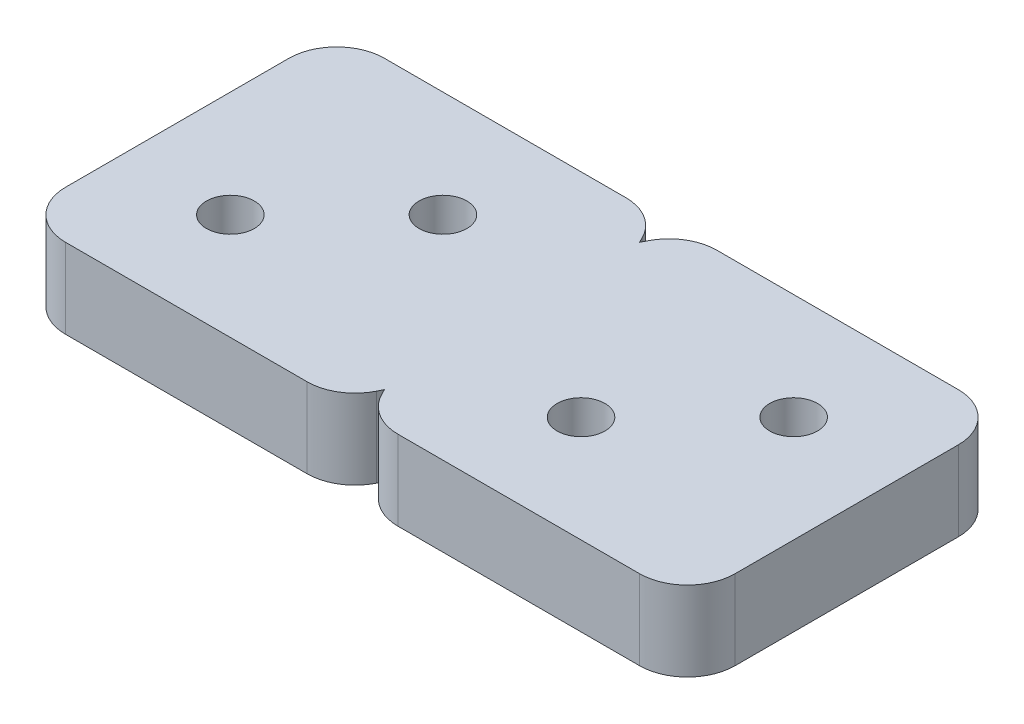
ISO-10303-21;
HEADER;
FILE_DESCRIPTION(('STEP AP214'),'2;1');
FILE_NAME('part.step','',(''),(''),'','','');
FILE_SCHEMA(('AUTOMOTIVE_DESIGN { 1 0 10303 214 1 1 1 1 }'));
ENDSEC;
DATA;
#1=APPLICATION_CONTEXT('core data for automotive mechanical design processes');
#2=APPLICATION_PROTOCOL_DEFINITION('international standard','automotive_design',2000,#1);
#3=PRODUCT_CONTEXT('',#1,'mechanical');
#4=PRODUCT('Part','Part','',(#3));
#5=PRODUCT_RELATED_PRODUCT_CATEGORY('part','',(#4));
#6=PRODUCT_DEFINITION_FORMATION('','',#4);
#7=PRODUCT_DEFINITION_CONTEXT('part definition',#1,'design');
#8=PRODUCT_DEFINITION('design','',#6,#7);
#9=PRODUCT_DEFINITION_SHAPE('','',#8);
#10=(LENGTH_UNIT() NAMED_UNIT(*) SI_UNIT(.MILLI.,.METRE.));
#11=(NAMED_UNIT(*) PLANE_ANGLE_UNIT() SI_UNIT($,.RADIAN.));
#12=(NAMED_UNIT(*) SI_UNIT($,.STERADIAN.) SOLID_ANGLE_UNIT());
#13=UNCERTAINTY_MEASURE_WITH_UNIT(LENGTH_MEASURE(1.E-05),#10,'distance_accuracy_value','');
#14=(GEOMETRIC_REPRESENTATION_CONTEXT(3) GLOBAL_UNCERTAINTY_ASSIGNED_CONTEXT((#13)) GLOBAL_UNIT_ASSIGNED_CONTEXT((#10,
#11,#12)) REPRESENTATION_CONTEXT('',''));
#15=CARTESIAN_POINT('',(0.,0.,0.));
#16=DIRECTION('',(0.,0.,1.));
#17=DIRECTION('',(1.,0.,0.));
#18=AXIS2_PLACEMENT_3D('',#15,#16,#17);
#19=CARTESIAN_POINT('',(0.,6.35,0.));
#20=DIRECTION('',(0.,1.,0.));
#21=DIRECTION('',(0.,0.,1.));
#22=AXIS2_PLACEMENT_3D('',#19,#20,#21);
#23=PLANE('',#22);
#24=CARTESIAN_POINT('',(-14.7588495726702,6.35,21.1656991837948));
#25=DIRECTION('',(0.,1.,0.));
#26=DIRECTION('',(0.,0.,1.));
#27=AXIS2_PLACEMENT_3D('',#24,#25,#26);
#28=CIRCLE('',#27,1.905);
#29=CARTESIAN_POINT('',(-14.7588495726702,6.35,23.0706991837948));
#30=VERTEX_POINT('',#29);
#31=EDGE_CURVE('E384',#30,#30,#28,.T.);
#32=ORIENTED_EDGE('',*,*,#31,.F.);
#33=EDGE_LOOP('',(#32));
#34=FACE_BOUND('',#33,.T.);
#35=CARTESIAN_POINT('',(-42.6988495726702,6.35,21.1656991837948));
#36=DIRECTION('',(0.,1.,0.));
#37=DIRECTION('',(0.,0.,1.));
#38=AXIS2_PLACEMENT_3D('',#35,#36,#37);
#39=CIRCLE('',#38,1.905);
#40=CARTESIAN_POINT('',(-42.6988495726702,6.35,23.0706991837948));
#41=VERTEX_POINT('',#40);
#42=EDGE_CURVE('E229',#41,#41,#39,.T.);
#43=ORIENTED_EDGE('',*,*,#42,.F.);
#44=EDGE_LOOP('',(#43));
#45=FACE_BOUND('',#44,.T.);
#46=DIRECTION('',(-1.,0.,0.));
#47=VECTOR('',#46,1.);
#48=CARTESIAN_POINT('',(-25.7642376761314,6.35,4.23108728725597));
#49=LINE('',#48,#47);
#50=CARTESIAN_POINT('',(-28.1189471732685,6.35,4.23108728725597));
#51=VERTEX_POINT('',#50);
#52=CARTESIAN_POINT('',(-47.3542376761314,6.35,4.23108728725597));
#53=VERTEX_POINT('',#52);
#54=EDGE_CURVE('E218',#51,#53,#49,.T.);
#55=ORIENTED_EDGE('',*,*,#54,.T.);
#56=CARTESIAN_POINT('',(-47.3542376761314,6.35,8.04108728725597));
#57=DIRECTION('',(0.,1.,0.));
#58=DIRECTION('',(0.,0.,1.));
#59=AXIS2_PLACEMENT_3D('',#56,#57,#58);
#60=CIRCLE('',#59,3.81);
#61=CARTESIAN_POINT('',(-51.1642376761314,6.35,8.04108728725597));
#62=VERTEX_POINT('',#61);
#63=EDGE_CURVE('E320',#53,#62,#60,.T.);
#64=ORIENTED_EDGE('',*,*,#63,.T.);
#65=DIRECTION('',(0.,0.,1.));
#66=VECTOR('',#65,1.);
#67=CARTESIAN_POINT('',(-51.1642376761314,6.35,4.23108728725597));
#68=LINE('',#67,#66);
#69=CARTESIAN_POINT('',(-51.1642376761314,6.35,25.821087287256));
#70=VERTEX_POINT('',#69);
#71=EDGE_CURVE('E221',#62,#70,#68,.T.);
#72=ORIENTED_EDGE('',*,*,#71,.T.);
#73=CARTESIAN_POINT('',(-47.3542376761314,6.35,25.821087287256));
#74=DIRECTION('',(0.,1.,0.));
#75=DIRECTION('',(0.,0.,1.));
#76=AXIS2_PLACEMENT_3D('',#73,#74,#75);
#77=CIRCLE('',#76,3.81);
#78=CARTESIAN_POINT('',(-47.3542376761314,6.35,29.631087287256));
#79=VERTEX_POINT('',#78);
#80=EDGE_CURVE('E301',#70,#79,#77,.T.);
#81=ORIENTED_EDGE('',*,*,#80,.T.);
#82=DIRECTION('',(1.,0.,0.));
#83=VECTOR('',#82,1.);
#84=CARTESIAN_POINT('',(-51.1642376761314,6.35,29.631087287256));
#85=LINE('',#84,#83);
#86=CARTESIAN_POINT('',(-28.1189471732685,6.35,29.631087287256));
#87=VERTEX_POINT('',#86);
#88=EDGE_CURVE('E180',#79,#87,#85,.T.);
#89=ORIENTED_EDGE('',*,*,#88,.T.);
#90=CARTESIAN_POINT('',(-28.1189471732685,6.35,25.821087287256));
#91=DIRECTION('',(0.,1.,0.));
#92=DIRECTION('',(0.,0.,1.));
#93=AXIS2_PLACEMENT_3D('',#90,#91,#92);
#94=CIRCLE('',#93,3.81);
#95=CARTESIAN_POINT('',(-24.7111795755588,6.35,27.5249710861108));
#96=VERTEX_POINT('',#95);
#97=EDGE_CURVE('E175',#87,#96,#94,.T.);
#98=ORIENTED_EDGE('',*,*,#97,.T.);
#99=DIRECTION('',(0.447213595499958,0.,-0.894427190999916));
#100=VECTOR('',#99,1.);
#101=CARTESIAN_POINT('',(-24.4942376761314,6.35,27.091087287256));
#102=LINE('',#101,#100);
#103=CARTESIAN_POINT('',(-24.4942376761314,6.35,27.091087287256));
#104=VERTEX_POINT('',#103);
#105=EDGE_CURVE('E166',#96,#104,#102,.T.);
#106=ORIENTED_EDGE('',*,*,#105,.T.);
#107=DIRECTION('',(0.447213595499958,0.,0.894427190999916));
#108=VECTOR('',#107,1.);
#109=CARTESIAN_POINT('',(-24.4942376761314,6.35,27.091087287256));
#110=LINE('',#109,#108);
#111=CARTESIAN_POINT('',(-24.277295776704,6.35,27.5249710861108));
#112=VERTEX_POINT('',#111);
#113=EDGE_CURVE('E171',#104,#112,#110,.T.);
#114=ORIENTED_EDGE('',*,*,#113,.T.);
#115=CARTESIAN_POINT('',(-20.8695281789943,6.35,25.821087287256));
#116=DIRECTION('',(0.,1.,0.));
#117=DIRECTION('',(0.,0.,1.));
#118=AXIS2_PLACEMENT_3D('',#115,#116,#117);
#119=CIRCLE('',#118,3.81);
#120=CARTESIAN_POINT('',(-20.8695281789943,6.35,29.631087287256));
#121=VERTEX_POINT('',#120);
#122=EDGE_CURVE('E306',#112,#121,#119,.T.);
#123=ORIENTED_EDGE('',*,*,#122,.T.);
#124=DIRECTION('',(1.,0.,0.));
#125=VECTOR('',#124,1.);
#126=CARTESIAN_POINT('',(-23.2242376761314,6.35,29.631087287256));
#127=LINE('',#126,#125);
#128=CARTESIAN_POINT('',(-1.63423767613143,6.35,29.631087287256));
#129=VERTEX_POINT('',#128);
#130=EDGE_CURVE('E198',#121,#129,#127,.T.);
#131=ORIENTED_EDGE('',*,*,#130,.T.);
#132=CARTESIAN_POINT('',(-1.63423767613143,6.35,25.821087287256));
#133=DIRECTION('',(0.,1.,0.));
#134=DIRECTION('',(0.,0.,1.));
#135=AXIS2_PLACEMENT_3D('',#132,#133,#134);
#136=CIRCLE('',#135,3.81);
#137=CARTESIAN_POINT('',(2.17576232386857,6.35,25.821087287256));
#138=VERTEX_POINT('',#137);
#139=EDGE_CURVE('E309',#129,#138,#136,.T.);
#140=ORIENTED_EDGE('',*,*,#139,.T.);
#141=DIRECTION('',(0.,0.,-1.));
#142=VECTOR('',#141,1.);
#143=CARTESIAN_POINT('',(2.17576232386857,6.35,29.631087287256));
#144=LINE('',#143,#142);
#145=CARTESIAN_POINT('',(2.17576232386857,6.35,8.04108728725596));
#146=VERTEX_POINT('',#145);
#147=EDGE_CURVE('E202',#138,#146,#144,.T.);
#148=ORIENTED_EDGE('',*,*,#147,.T.);
#149=CARTESIAN_POINT('',(-1.63423767613143,6.35,8.04108728725596));
#150=DIRECTION('',(0.,1.,0.));
#151=DIRECTION('',(0.,0.,1.));
#152=AXIS2_PLACEMENT_3D('',#149,#150,#151);
#153=CIRCLE('',#152,3.81);
#154=CARTESIAN_POINT('',(-1.63423767613143,6.35,4.23108728725597));
#155=VERTEX_POINT('',#154);
#156=EDGE_CURVE('E312',#146,#155,#153,.T.);
#157=ORIENTED_EDGE('',*,*,#156,.T.);
#158=DIRECTION('',(-1.,0.,0.));
#159=VECTOR('',#158,1.);
#160=CARTESIAN_POINT('',(2.17576232386857,6.35,4.23108728725596));
#161=LINE('',#160,#159);
#162=CARTESIAN_POINT('',(-20.8695281789943,6.35,4.23108728725597));
#163=VERTEX_POINT('',#162);
#164=EDGE_CURVE('E209',#155,#163,#161,.T.);
#165=ORIENTED_EDGE('',*,*,#164,.T.);
#166=CARTESIAN_POINT('',(-20.8695281789943,6.35,8.04108728725597));
#167=DIRECTION('',(0.,1.,0.));
#168=DIRECTION('',(0.,0.,1.));
#169=AXIS2_PLACEMENT_3D('',#166,#167,#168);
#170=CIRCLE('',#169,3.81);
#171=CARTESIAN_POINT('',(-24.277295776704,6.35,6.33720348840113));
#172=VERTEX_POINT('',#171);
#173=EDGE_CURVE('E63',#163,#172,#170,.T.);
#174=ORIENTED_EDGE('',*,*,#173,.T.);
#175=DIRECTION('',(-0.447213595499958,0.,0.894427190999916));
#176=VECTOR('',#175,1.);
#177=CARTESIAN_POINT('',(-24.4942376761314,6.35,6.77108728725597));
#178=LINE('',#177,#176);
#179=CARTESIAN_POINT('',(-24.4942376761314,6.35,6.77108728725597));
#180=VERTEX_POINT('',#179);
#181=EDGE_CURVE('E212',#172,#180,#178,.T.);
#182=ORIENTED_EDGE('',*,*,#181,.T.);
#183=DIRECTION('',(-0.447213595499958,0.,-0.894427190999916));
#184=VECTOR('',#183,1.);
#185=CARTESIAN_POINT('',(-24.4942376761314,6.35,6.77108728725597));
#186=LINE('',#185,#184);
#187=CARTESIAN_POINT('',(-24.7111795755588,6.35,6.33720348840113));
#188=VERTEX_POINT('',#187);
#189=EDGE_CURVE('E215',#180,#188,#186,.T.);
#190=ORIENTED_EDGE('',*,*,#189,.T.);
#191=CARTESIAN_POINT('',(-28.1189471732685,6.35,8.04108728725597));
#192=DIRECTION('',(0.,1.,0.));
#193=DIRECTION('',(0.,0.,1.));
#194=AXIS2_PLACEMENT_3D('',#191,#192,#193);
#195=CIRCLE('',#194,3.81);
#196=EDGE_CURVE('E315',#188,#51,#195,.T.);
#197=ORIENTED_EDGE('',*,*,#196,.T.);
#198=EDGE_LOOP('',(#55,#64,#72,#81,#89,#98,#106,#114,#123,#131,#140,#148,#157,#165,#174,#182,
#190,#197));
#199=FACE_BOUND('',#198,.T.);
#200=CARTESIAN_POINT('',(-34.2296257795926,6.35,12.6964753907172));
#201=DIRECTION('',(0.,1.,0.));
#202=DIRECTION('',(0.,0.,1.));
#203=AXIS2_PLACEMENT_3D('',#200,#201,#202);
#204=CIRCLE('',#203,1.905);
#205=CARTESIAN_POINT('',(-34.2296257795926,6.35,14.6014753907172));
#206=VERTEX_POINT('',#205);
#207=EDGE_CURVE('E376',#206,#206,#204,.T.);
#208=ORIENTED_EDGE('',*,*,#207,.F.);
#209=EDGE_LOOP('',(#208));
#210=FACE_BOUND('',#209,.T.);
#211=CARTESIAN_POINT('',(-6.28962577959262,6.35,12.6964753907172));
#212=DIRECTION('',(0.,1.,0.));
#213=DIRECTION('',(0.,0.,1.));
#214=AXIS2_PLACEMENT_3D('',#211,#212,#213);
#215=CIRCLE('',#214,1.905);
#216=CARTESIAN_POINT('',(-6.28962577959262,6.35,14.6014753907172));
#217=VERTEX_POINT('',#216);
#218=EDGE_CURVE('E392',#217,#217,#215,.T.);
#219=ORIENTED_EDGE('',*,*,#218,.F.);
#220=EDGE_LOOP('',(#219));
#221=FACE_BOUND('',#220,.T.);
#222=ADVANCED_FACE('F39',(#34,#45,#199,#210,#221),#23,.T.);
#223=CARTESIAN_POINT('',(0.,0.,0.));
#224=DIRECTION('',(0.,1.,0.));
#225=DIRECTION('',(0.,0.,1.));
#226=AXIS2_PLACEMENT_3D('',#223,#224,#225);
#227=PLANE('',#226);
#228=DIRECTION('',(0.,0.,1.));
#229=VECTOR('',#228,1.);
#230=CARTESIAN_POINT('',(-51.1642376761314,0.,4.23108728725597));
#231=LINE('',#230,#229);
#232=CARTESIAN_POINT('',(-51.1642376761314,0.,8.04108728725597));
#233=VERTEX_POINT('',#232);
#234=CARTESIAN_POINT('',(-51.1642376761314,0.,25.821087287256));
#235=VERTEX_POINT('',#234);
#236=EDGE_CURVE('E257',#233,#235,#231,.T.);
#237=ORIENTED_EDGE('',*,*,#236,.F.);
#238=CARTESIAN_POINT('',(-47.3542376761314,0.,8.04108728725597));
#239=DIRECTION('',(0.,1.,0.));
#240=DIRECTION('',(0.,0.,1.));
#241=AXIS2_PLACEMENT_3D('',#238,#239,#240);
#242=CIRCLE('',#241,3.81);
#243=CARTESIAN_POINT('',(-47.3542376761314,0.,4.23108728725597));
#244=VERTEX_POINT('',#243);
#245=EDGE_CURVE('E291',#233,#244,#242,.F.);
#246=ORIENTED_EDGE('',*,*,#245,.T.);
#247=DIRECTION('',(-1.,0.,0.));
#248=VECTOR('',#247,1.);
#249=CARTESIAN_POINT('',(-25.7642376761314,0.,4.23108728725597));
#250=LINE('',#249,#248);
#251=CARTESIAN_POINT('',(-28.1189471732685,0.,4.23108728725597));
#252=VERTEX_POINT('',#251);
#253=EDGE_CURVE('E253',#252,#244,#250,.T.);
#254=ORIENTED_EDGE('',*,*,#253,.F.);
#255=CARTESIAN_POINT('',(-28.1189471732685,0.,8.04108728725597));
#256=DIRECTION('',(0.,1.,0.));
#257=DIRECTION('',(0.,0.,1.));
#258=AXIS2_PLACEMENT_3D('',#255,#256,#257);
#259=CIRCLE('',#258,3.81);
#260=CARTESIAN_POINT('',(-24.7111795755588,0.,6.33720348840113));
#261=VERTEX_POINT('',#260);
#262=EDGE_CURVE('E285',#252,#261,#259,.F.);
#263=ORIENTED_EDGE('',*,*,#262,.T.);
#264=DIRECTION('',(-0.447213595499958,0.,-0.894427190999916));
#265=VECTOR('',#264,1.);
#266=CARTESIAN_POINT('',(-24.4942376761314,0.,6.77108728725597));
#267=LINE('',#266,#265);
#268=CARTESIAN_POINT('',(-24.4942376761314,0.,6.77108728725597));
#269=VERTEX_POINT('',#268);
#270=EDGE_CURVE('E250',#269,#261,#267,.T.);
#271=ORIENTED_EDGE('',*,*,#270,.F.);
#272=DIRECTION('',(-0.447213595499958,0.,0.894427190999916));
#273=VECTOR('',#272,1.);
#274=CARTESIAN_POINT('',(-24.4942376761314,0.,6.77108728725597));
#275=LINE('',#274,#273);
#276=CARTESIAN_POINT('',(-24.277295776704,0.,6.33720348840113));
#277=VERTEX_POINT('',#276);
#278=EDGE_CURVE('E247',#277,#269,#275,.T.);
#279=ORIENTED_EDGE('',*,*,#278,.F.);
#280=CARTESIAN_POINT('',(-20.8695281789943,0.,8.04108728725597));
#281=DIRECTION('',(0.,1.,0.));
#282=DIRECTION('',(0.,0.,1.));
#283=AXIS2_PLACEMENT_3D('',#280,#281,#282);
#284=CIRCLE('',#283,3.81);
#285=CARTESIAN_POINT('',(-20.8695281789943,0.,4.23108728725597));
#286=VERTEX_POINT('',#285);
#287=EDGE_CURVE('E288',#277,#286,#284,.F.);
#288=ORIENTED_EDGE('',*,*,#287,.T.);
#289=DIRECTION('',(-1.,0.,0.));
#290=VECTOR('',#289,1.);
#291=CARTESIAN_POINT('',(2.17576232386857,0.,4.23108728725596));
#292=LINE('',#291,#290);
#293=CARTESIAN_POINT('',(-1.63423767613143,0.,4.23108728725597));
#294=VERTEX_POINT('',#293);
#295=EDGE_CURVE('E243',#294,#286,#292,.T.);
#296=ORIENTED_EDGE('',*,*,#295,.F.);
#297=CARTESIAN_POINT('',(-1.63423767613143,0.,8.04108728725596));
#298=DIRECTION('',(0.,1.,0.));
#299=DIRECTION('',(0.,0.,1.));
#300=AXIS2_PLACEMENT_3D('',#297,#298,#299);
#301=CIRCLE('',#300,3.81);
#302=CARTESIAN_POINT('',(2.17576232386857,0.,8.04108728725596));
#303=VERTEX_POINT('',#302);
#304=EDGE_CURVE('E282',#294,#303,#301,.F.);
#305=ORIENTED_EDGE('',*,*,#304,.T.);
#306=DIRECTION('',(0.,0.,-1.));
#307=VECTOR('',#306,1.);
#308=CARTESIAN_POINT('',(2.17576232386857,0.,29.631087287256));
#309=LINE('',#308,#307);
#310=CARTESIAN_POINT('',(2.17576232386857,0.,25.821087287256));
#311=VERTEX_POINT('',#310);
#312=EDGE_CURVE('E239',#311,#303,#309,.T.);
#313=ORIENTED_EDGE('',*,*,#312,.F.);
#314=CARTESIAN_POINT('',(-1.63423767613143,0.,25.821087287256));
#315=DIRECTION('',(0.,1.,0.));
#316=DIRECTION('',(0.,0.,1.));
#317=AXIS2_PLACEMENT_3D('',#314,#315,#316);
#318=CIRCLE('',#317,3.81);
#319=CARTESIAN_POINT('',(-1.63423767613143,0.,29.631087287256));
#320=VERTEX_POINT('',#319);
#321=EDGE_CURVE('E279',#311,#320,#318,.F.);
#322=ORIENTED_EDGE('',*,*,#321,.T.);
#323=DIRECTION('',(1.,0.,0.));
#324=VECTOR('',#323,1.);
#325=CARTESIAN_POINT('',(-23.2242376761314,0.,29.631087287256));
#326=LINE('',#325,#324);
#327=CARTESIAN_POINT('',(-20.8695281789943,0.,29.631087287256));
#328=VERTEX_POINT('',#327);
#329=EDGE_CURVE('E235',#328,#320,#326,.T.);
#330=ORIENTED_EDGE('',*,*,#329,.F.);
#331=CARTESIAN_POINT('',(-20.8695281789943,0.,25.821087287256));
#332=DIRECTION('',(0.,1.,0.));
#333=DIRECTION('',(0.,0.,1.));
#334=AXIS2_PLACEMENT_3D('',#331,#332,#333);
#335=CIRCLE('',#334,3.81);
#336=CARTESIAN_POINT('',(-24.277295776704,0.,27.5249710861108));
#337=VERTEX_POINT('',#336);
#338=EDGE_CURVE('E276',#328,#337,#335,.F.);
#339=ORIENTED_EDGE('',*,*,#338,.T.);
#340=DIRECTION('',(0.447213595499958,0.,0.894427190999916));
#341=VECTOR('',#340,1.);
#342=CARTESIAN_POINT('',(-24.4942376761314,0.,27.091087287256));
#343=LINE('',#342,#341);
#344=CARTESIAN_POINT('',(-24.4942376761314,0.,27.091087287256));
#345=VERTEX_POINT('',#344);
#346=EDGE_CURVE('E232',#345,#337,#343,.T.);
#347=ORIENTED_EDGE('',*,*,#346,.F.);
#348=DIRECTION('',(0.447213595499958,0.,-0.894427190999916));
#349=VECTOR('',#348,1.);
#350=CARTESIAN_POINT('',(-24.4942376761314,0.,27.091087287256));
#351=LINE('',#350,#349);
#352=CARTESIAN_POINT('',(-24.7111795755588,0.,27.5249710861108));
#353=VERTEX_POINT('',#352);
#354=EDGE_CURVE('E186',#353,#345,#351,.T.);
#355=ORIENTED_EDGE('',*,*,#354,.F.);
#356=CARTESIAN_POINT('',(-28.1189471732685,0.,25.821087287256));
#357=DIRECTION('',(0.,1.,0.));
#358=DIRECTION('',(0.,0.,1.));
#359=AXIS2_PLACEMENT_3D('',#356,#357,#358);
#360=CIRCLE('',#359,3.81);
#361=CARTESIAN_POINT('',(-28.1189471732685,0.,29.631087287256));
#362=VERTEX_POINT('',#361);
#363=EDGE_CURVE('E273',#353,#362,#360,.F.);
#364=ORIENTED_EDGE('',*,*,#363,.T.);
#365=DIRECTION('',(1.,0.,0.));
#366=VECTOR('',#365,1.);
#367=CARTESIAN_POINT('',(-51.1642376761314,0.,29.631087287256));
#368=LINE('',#367,#366);
#369=CARTESIAN_POINT('',(-47.3542376761314,0.,29.631087287256));
#370=VERTEX_POINT('',#369);
#371=EDGE_CURVE('E225',#370,#362,#368,.T.);
#372=ORIENTED_EDGE('',*,*,#371,.F.);
#373=CARTESIAN_POINT('',(-47.3542376761314,0.,25.821087287256));
#374=DIRECTION('',(0.,1.,0.));
#375=DIRECTION('',(0.,0.,1.));
#376=AXIS2_PLACEMENT_3D('',#373,#374,#375);
#377=CIRCLE('',#376,3.81);
#378=EDGE_CURVE('E270',#370,#235,#377,.F.);
#379=ORIENTED_EDGE('',*,*,#378,.T.);
#380=EDGE_LOOP('',(#237,#246,#254,#263,#271,#279,#288,#296,#305,#313,#322,#330,#339,#347,#355,
#364,#372,#379));
#381=FACE_BOUND('',#380,.T.);
#382=CARTESIAN_POINT('',(-42.6988495726702,0.,21.1656991837948));
#383=DIRECTION('',(0.,1.,0.));
#384=DIRECTION('',(0.,0.,1.));
#385=AXIS2_PLACEMENT_3D('',#382,#383,#384);
#386=CIRCLE('',#385,1.905);
#387=CARTESIAN_POINT('',(-42.6988495726702,0.,23.0706991837948));
#388=VERTEX_POINT('',#387);
#389=EDGE_CURVE('E372',#388,#388,#386,.T.);
#390=ORIENTED_EDGE('',*,*,#389,.T.);
#391=EDGE_LOOP('',(#390));
#392=FACE_BOUND('',#391,.T.);
#393=CARTESIAN_POINT('',(-34.2296257795926,0.,12.6964753907172));
#394=DIRECTION('',(0.,1.,0.));
#395=DIRECTION('',(0.,0.,1.));
#396=AXIS2_PLACEMENT_3D('',#393,#394,#395);
#397=CIRCLE('',#396,1.905);
#398=CARTESIAN_POINT('',(-34.2296257795926,0.,14.6014753907172));
#399=VERTEX_POINT('',#398);
#400=EDGE_CURVE('E380',#399,#399,#397,.T.);
#401=ORIENTED_EDGE('',*,*,#400,.T.);
#402=EDGE_LOOP('',(#401));
#403=FACE_BOUND('',#402,.T.);
#404=CARTESIAN_POINT('',(-14.7588495726702,0.,21.1656991837948));
#405=DIRECTION('',(0.,1.,0.));
#406=DIRECTION('',(0.,0.,1.));
#407=AXIS2_PLACEMENT_3D('',#404,#405,#406);
#408=CIRCLE('',#407,1.905);
#409=CARTESIAN_POINT('',(-14.7588495726702,0.,23.0706991837948));
#410=VERTEX_POINT('',#409);
#411=EDGE_CURVE('E388',#410,#410,#408,.T.);
#412=ORIENTED_EDGE('',*,*,#411,.T.);
#413=EDGE_LOOP('',(#412));
#414=FACE_BOUND('',#413,.T.);
#415=CARTESIAN_POINT('',(-6.28962577959262,0.,12.6964753907172));
#416=DIRECTION('',(0.,1.,0.));
#417=DIRECTION('',(0.,0.,1.));
#418=AXIS2_PLACEMENT_3D('',#415,#416,#417);
#419=CIRCLE('',#418,1.905);
#420=CARTESIAN_POINT('',(-6.28962577959262,0.,14.6014753907172));
#421=VERTEX_POINT('',#420);
#422=EDGE_CURVE('E396',#421,#421,#419,.T.);
#423=ORIENTED_EDGE('',*,*,#422,.T.);
#424=EDGE_LOOP('',(#423));
#425=FACE_BOUND('',#424,.T.);
#426=ADVANCED_FACE('F366',(#381,#392,#403,#414,#425),#227,.F.);
#427=CARTESIAN_POINT('',(-51.1642376761314,6.35,29.631087287256));
#428=DIRECTION('',(0.,0.,-1.));
#429=DIRECTION('',(-1.,0.,0.));
#430=AXIS2_PLACEMENT_3D('',#427,#428,#429);
#431=PLANE('',#430);
#432=ORIENTED_EDGE('',*,*,#371,.T.);
#433=DIRECTION('',(0.,-1.,0.));
#434=VECTOR('',#433,1.);
#435=CARTESIAN_POINT('',(-28.1189471732685,6.35,29.631087287256));
#436=LINE('',#435,#434);
#437=EDGE_CURVE('E11',#362,#87,#436,.F.);
#438=ORIENTED_EDGE('',*,*,#437,.T.);
#439=ORIENTED_EDGE('',*,*,#88,.F.);
#440=DIRECTION('',(0.,-1.,0.));
#441=VECTOR('',#440,1.);
#442=CARTESIAN_POINT('',(-47.3542376761314,6.35,29.631087287256));
#443=LINE('',#442,#441);
#444=EDGE_CURVE('E48',#79,#370,#443,.T.);
#445=ORIENTED_EDGE('',*,*,#444,.T.);
#446=EDGE_LOOP('',(#432,#438,#439,#445));
#447=FACE_BOUND('',#446,.T.);
#448=ADVANCED_FACE('F360',(#447),#431,.F.);
#449=CARTESIAN_POINT('',(-24.4942376761314,6.35,27.091087287256));
#450=DIRECTION('',(-0.894427190999916,0.,-0.447213595499958));
#451=DIRECTION('',(-0.447213595499958,0.,0.894427190999916));
#452=AXIS2_PLACEMENT_3D('',#449,#450,#451);
#453=PLANE('',#452);
#454=ORIENTED_EDGE('',*,*,#105,.F.);
#455=DIRECTION('',(0.,-1.,0.));
#456=VECTOR('',#455,1.);
#457=CARTESIAN_POINT('',(-24.7111795755588,6.35,27.5249710861108));
#458=LINE('',#457,#456);
#459=EDGE_CURVE('E352',#96,#353,#458,.T.);
#460=ORIENTED_EDGE('',*,*,#459,.T.);
#461=ORIENTED_EDGE('',*,*,#354,.T.);
#462=DIRECTION('',(0.,-1.,0.));
#463=VECTOR('',#462,1.);
#464=CARTESIAN_POINT('',(-24.4942376761314,6.35,27.091087287256));
#465=LINE('',#464,#463);
#466=EDGE_CURVE('E183',#104,#345,#465,.T.);
#467=ORIENTED_EDGE('',*,*,#466,.F.);
#468=EDGE_LOOP('',(#454,#460,#461,#467));
#469=FACE_BOUND('',#468,.T.);
#470=ADVANCED_FACE('F184',(#469),#453,.F.);
#471=CARTESIAN_POINT('',(-24.4942376761314,6.35,27.091087287256));
#472=DIRECTION('',(0.894427190999916,0.,-0.447213595499958));
#473=DIRECTION('',(-0.447213595499958,0.,-0.894427190999916));
#474=AXIS2_PLACEMENT_3D('',#471,#472,#473);
#475=PLANE('',#474);
#476=ORIENTED_EDGE('',*,*,#346,.T.);
#477=DIRECTION('',(0.,-1.,0.));
#478=VECTOR('',#477,1.);
#479=CARTESIAN_POINT('',(-24.277295776704,6.35,27.5249710861108));
#480=LINE('',#479,#478);
#481=EDGE_CURVE('E196',#337,#112,#480,.F.);
#482=ORIENTED_EDGE('',*,*,#481,.T.);
#483=ORIENTED_EDGE('',*,*,#113,.F.);
#484=ORIENTED_EDGE('',*,*,#466,.T.);
#485=EDGE_LOOP('',(#476,#482,#483,#484));
#486=FACE_BOUND('',#485,.T.);
#487=ADVANCED_FACE('F194',(#486),#475,.F.);
#488=CARTESIAN_POINT('',(-23.2242376761314,6.35,29.631087287256));
#489=DIRECTION('',(0.,0.,-1.));
#490=DIRECTION('',(-1.,0.,0.));
#491=AXIS2_PLACEMENT_3D('',#488,#489,#490);
#492=PLANE('',#491);
#493=ORIENTED_EDGE('',*,*,#329,.T.);
#494=DIRECTION('',(0.,-1.,0.));
#495=VECTOR('',#494,1.);
#496=CARTESIAN_POINT('',(-1.63423767613143,6.35,29.631087287256));
#497=LINE('',#496,#495);
#498=EDGE_CURVE('E347',#320,#129,#497,.F.);
#499=ORIENTED_EDGE('',*,*,#498,.T.);
#500=ORIENTED_EDGE('',*,*,#130,.F.);
#501=DIRECTION('',(0.,-1.,0.));
#502=VECTOR('',#501,1.);
#503=CARTESIAN_POINT('',(-20.8695281789943,6.35,29.631087287256));
#504=LINE('',#503,#502);
#505=EDGE_CURVE('E343',#121,#328,#504,.T.);
#506=ORIENTED_EDGE('',*,*,#505,.T.);
#507=EDGE_LOOP('',(#493,#499,#500,#506));
#508=FACE_BOUND('',#507,.T.);
#509=ADVANCED_FACE('F442',(#508),#492,.F.);
#510=CARTESIAN_POINT('',(2.17576232386857,6.35,29.631087287256));
#511=DIRECTION('',(-1.,0.,0.));
#512=DIRECTION('',(0.,0.,1.));
#513=AXIS2_PLACEMENT_3D('',#510,#511,#512);
#514=PLANE('',#513);
#515=ORIENTED_EDGE('',*,*,#312,.T.);
#516=DIRECTION('',(0.,-1.,0.));
#517=VECTOR('',#516,1.);
#518=CARTESIAN_POINT('',(2.17576232386857,6.35,8.04108728725596));
#519=LINE('',#518,#517);
#520=EDGE_CURVE('E340',#303,#146,#519,.F.);
#521=ORIENTED_EDGE('',*,*,#520,.T.);
#522=ORIENTED_EDGE('',*,*,#147,.F.);
#523=DIRECTION('',(0.,-1.,0.));
#524=VECTOR('',#523,1.);
#525=CARTESIAN_POINT('',(2.17576232386857,6.35,25.821087287256));
#526=LINE('',#525,#524);
#527=EDGE_CURVE('E336',#138,#311,#526,.T.);
#528=ORIENTED_EDGE('',*,*,#527,.T.);
#529=EDGE_LOOP('',(#515,#521,#522,#528));
#530=FACE_BOUND('',#529,.T.);
#531=ADVANCED_FACE('F438',(#530),#514,.F.);
#532=CARTESIAN_POINT('',(2.17576232386857,6.35,4.23108728725596));
#533=DIRECTION('',(0.,0.,1.));
#534=DIRECTION('',(1.,0.,0.));
#535=AXIS2_PLACEMENT_3D('',#532,#533,#534);
#536=PLANE('',#535);
#537=ORIENTED_EDGE('',*,*,#295,.T.);
#538=DIRECTION('',(0.,-1.,0.));
#539=VECTOR('',#538,1.);
#540=CARTESIAN_POINT('',(-20.8695281789943,6.35,4.23108728725597));
#541=LINE('',#540,#539);
#542=EDGE_CURVE('E331',#286,#163,#541,.F.);
#543=ORIENTED_EDGE('',*,*,#542,.T.);
#544=ORIENTED_EDGE('',*,*,#164,.F.);
#545=DIRECTION('',(0.,-1.,0.));
#546=VECTOR('',#545,1.);
#547=CARTESIAN_POINT('',(-1.63423767613143,6.35,4.23108728725597));
#548=LINE('',#547,#546);
#549=EDGE_CURVE('E327',#155,#294,#548,.T.);
#550=ORIENTED_EDGE('',*,*,#549,.T.);
#551=EDGE_LOOP('',(#537,#543,#544,#550));
#552=FACE_BOUND('',#551,.T.);
#553=ADVANCED_FACE('F434',(#552),#536,.F.);
#554=CARTESIAN_POINT('',(-24.4942376761314,6.35,6.77108728725597));
#555=DIRECTION('',(0.894427190999916,0.,0.447213595499958));
#556=DIRECTION('',(0.447213595499958,0.,-0.894427190999916));
#557=AXIS2_PLACEMENT_3D('',#554,#555,#556);
#558=PLANE('',#557);
#559=ORIENTED_EDGE('',*,*,#181,.F.);
#560=DIRECTION('',(0.,-1.,0.));
#561=VECTOR('',#560,1.);
#562=CARTESIAN_POINT('',(-24.277295776704,6.35,6.33720348840113));
#563=LINE('',#562,#561);
#564=EDGE_CURVE('E323',#172,#277,#563,.T.);
#565=ORIENTED_EDGE('',*,*,#564,.T.);
#566=ORIENTED_EDGE('',*,*,#278,.T.);
#567=DIRECTION('',(0.,-1.,0.));
#568=VECTOR('',#567,1.);
#569=CARTESIAN_POINT('',(-24.4942376761314,6.35,6.77108728725597));
#570=LINE('',#569,#568);
#571=EDGE_CURVE('E192',#180,#269,#570,.T.);
#572=ORIENTED_EDGE('',*,*,#571,.F.);
#573=EDGE_LOOP('',(#559,#565,#566,#572));
#574=FACE_BOUND('',#573,.T.);
#575=ADVANCED_FACE('F431',(#574),#558,.F.);
#576=CARTESIAN_POINT('',(-24.4942376761314,6.35,6.77108728725597));
#577=DIRECTION('',(-0.894427190999916,0.,0.447213595499958));
#578=DIRECTION('',(0.447213595499958,0.,0.894427190999916));
#579=AXIS2_PLACEMENT_3D('',#576,#577,#578);
#580=PLANE('',#579);
#581=ORIENTED_EDGE('',*,*,#270,.T.);
#582=DIRECTION('',(0.,-1.,0.));
#583=VECTOR('',#582,1.);
#584=CARTESIAN_POINT('',(-24.7111795755588,6.35,6.33720348840113));
#585=LINE('',#584,#583);
#586=EDGE_CURVE('E55',#261,#188,#585,.F.);
#587=ORIENTED_EDGE('',*,*,#586,.T.);
#588=ORIENTED_EDGE('',*,*,#189,.F.);
#589=ORIENTED_EDGE('',*,*,#571,.T.);
#590=EDGE_LOOP('',(#581,#587,#588,#589));
#591=FACE_BOUND('',#590,.T.);
#592=ADVANCED_FACE('F427',(#591),#580,.F.);
#593=CARTESIAN_POINT('',(-25.7642376761314,6.35,4.23108728725597));
#594=DIRECTION('',(0.,0.,1.));
#595=DIRECTION('',(1.,0.,0.));
#596=AXIS2_PLACEMENT_3D('',#593,#594,#595);
#597=PLANE('',#596);
#598=ORIENTED_EDGE('',*,*,#253,.T.);
#599=DIRECTION('',(0.,-1.,0.));
#600=VECTOR('',#599,1.);
#601=CARTESIAN_POINT('',(-47.3542376761314,6.35,4.23108728725597));
#602=LINE('',#601,#600);
#603=EDGE_CURVE('E298',#244,#53,#602,.F.);
#604=ORIENTED_EDGE('',*,*,#603,.T.);
#605=ORIENTED_EDGE('',*,*,#54,.F.);
#606=DIRECTION('',(0.,-1.,0.));
#607=VECTOR('',#606,1.);
#608=CARTESIAN_POINT('',(-28.1189471732685,6.35,4.23108728725597));
#609=LINE('',#608,#607);
#610=EDGE_CURVE('E294',#51,#252,#609,.T.);
#611=ORIENTED_EDGE('',*,*,#610,.T.);
#612=EDGE_LOOP('',(#598,#604,#605,#611));
#613=FACE_BOUND('',#612,.T.);
#614=ADVANCED_FACE('F423',(#613),#597,.F.);
#615=CARTESIAN_POINT('',(-51.1642376761314,6.35,4.23108728725597));
#616=DIRECTION('',(1.,0.,0.));
#617=DIRECTION('',(0.,0.,-1.));
#618=AXIS2_PLACEMENT_3D('',#615,#616,#617);
#619=PLANE('',#618);
#620=ORIENTED_EDGE('',*,*,#71,.F.);
#621=DIRECTION('',(0.,-1.,0.));
#622=VECTOR('',#621,1.);
#623=CARTESIAN_POINT('',(-51.1642376761314,6.35,8.04108728725597));
#624=LINE('',#623,#622);
#625=EDGE_CURVE('E266',#62,#233,#624,.T.);
#626=ORIENTED_EDGE('',*,*,#625,.T.);
#627=ORIENTED_EDGE('',*,*,#236,.T.);
#628=DIRECTION('',(0.,-1.,0.));
#629=VECTOR('',#628,1.);
#630=CARTESIAN_POINT('',(-51.1642376761314,6.35,25.821087287256));
#631=LINE('',#630,#629);
#632=EDGE_CURVE('E191',#235,#70,#631,.F.);
#633=ORIENTED_EDGE('',*,*,#632,.T.);
#634=EDGE_LOOP('',(#620,#626,#627,#633));
#635=FACE_BOUND('',#634,.T.);
#636=ADVANCED_FACE('F420',(#635),#619,.F.);
#637=CARTESIAN_POINT('',(-42.6988495726702,6.35,21.1656991837948));
#638=DIRECTION('',(0.,-1.,0.));
#639=DIRECTION('',(0.,0.,-1.));
#640=AXIS2_PLACEMENT_3D('',#637,#638,#639);
#641=CYLINDRICAL_SURFACE('',#640,1.905);
#642=ORIENTED_EDGE('',*,*,#42,.T.);
#643=EDGE_LOOP('',(#642));
#644=FACE_BOUND('',#643,.T.);
#645=ORIENTED_EDGE('',*,*,#389,.F.);
#646=EDGE_LOOP('',(#645));
#647=FACE_BOUND('',#646,.T.);
#648=ADVANCED_FACE('F417',(#644,#647),#641,.F.);
#649=CARTESIAN_POINT('',(-34.2296257795926,6.35,12.6964753907172));
#650=DIRECTION('',(0.,-1.,0.));
#651=DIRECTION('',(0.,0.,-1.));
#652=AXIS2_PLACEMENT_3D('',#649,#650,#651);
#653=CYLINDRICAL_SURFACE('',#652,1.905);
#654=ORIENTED_EDGE('',*,*,#207,.T.);
#655=EDGE_LOOP('',(#654));
#656=FACE_BOUND('',#655,.T.);
#657=ORIENTED_EDGE('',*,*,#400,.F.);
#658=EDGE_LOOP('',(#657));
#659=FACE_BOUND('',#658,.T.);
#660=ADVANCED_FACE('F639',(#656,#659),#653,.F.);
#661=CARTESIAN_POINT('',(-14.7588495726702,6.35,21.1656991837948));
#662=DIRECTION('',(0.,-1.,0.));
#663=DIRECTION('',(0.,0.,-1.));
#664=AXIS2_PLACEMENT_3D('',#661,#662,#663);
#665=CYLINDRICAL_SURFACE('',#664,1.905);
#666=ORIENTED_EDGE('',*,*,#31,.T.);
#667=EDGE_LOOP('',(#666));
#668=FACE_BOUND('',#667,.T.);
#669=ORIENTED_EDGE('',*,*,#411,.F.);
#670=EDGE_LOOP('',(#669));
#671=FACE_BOUND('',#670,.T.);
#672=ADVANCED_FACE('F630',(#668,#671),#665,.F.);
#673=CARTESIAN_POINT('',(-6.28962577959262,6.35,12.6964753907172));
#674=DIRECTION('',(0.,-1.,0.));
#675=DIRECTION('',(0.,0.,-1.));
#676=AXIS2_PLACEMENT_3D('',#673,#674,#675);
#677=CYLINDRICAL_SURFACE('',#676,1.905);
#678=ORIENTED_EDGE('',*,*,#218,.T.);
#679=EDGE_LOOP('',(#678));
#680=FACE_BOUND('',#679,.T.);
#681=ORIENTED_EDGE('',*,*,#422,.F.);
#682=EDGE_LOOP('',(#681));
#683=FACE_BOUND('',#682,.T.);
#684=ADVANCED_FACE('F404',(#680,#683),#677,.F.);
#685=CARTESIAN_POINT('',(-47.3542376761314,6.35,8.04108728725597));
#686=DIRECTION('',(0.,-1.,0.));
#687=DIRECTION('',(0.,0.,-1.));
#688=AXIS2_PLACEMENT_3D('',#685,#686,#687);
#689=CYLINDRICAL_SURFACE('',#688,3.81);
#690=ORIENTED_EDGE('',*,*,#63,.F.);
#691=ORIENTED_EDGE('',*,*,#603,.F.);
#692=ORIENTED_EDGE('',*,*,#245,.F.);
#693=ORIENTED_EDGE('',*,*,#625,.F.);
#694=EDGE_LOOP('',(#690,#691,#692,#693));
#695=FACE_BOUND('',#694,.T.);
#696=ADVANCED_FACE('F453',(#695),#689,.T.);
#697=CARTESIAN_POINT('',(-20.8695281789943,6.35,8.04108728725597));
#698=DIRECTION('',(0.,-1.,0.));
#699=DIRECTION('',(0.,0.,-1.));
#700=AXIS2_PLACEMENT_3D('',#697,#698,#699);
#701=CYLINDRICAL_SURFACE('',#700,3.81);
#702=ORIENTED_EDGE('',*,*,#173,.F.);
#703=ORIENTED_EDGE('',*,*,#542,.F.);
#704=ORIENTED_EDGE('',*,*,#287,.F.);
#705=ORIENTED_EDGE('',*,*,#564,.F.);
#706=EDGE_LOOP('',(#702,#703,#704,#705));
#707=FACE_BOUND('',#706,.T.);
#708=ADVANCED_FACE('F456',(#707),#701,.T.);
#709=CARTESIAN_POINT('',(-28.1189471732685,6.35,8.04108728725597));
#710=DIRECTION('',(0.,-1.,0.));
#711=DIRECTION('',(0.,0.,-1.));
#712=AXIS2_PLACEMENT_3D('',#709,#710,#711);
#713=CYLINDRICAL_SURFACE('',#712,3.81);
#714=ORIENTED_EDGE('',*,*,#196,.F.);
#715=ORIENTED_EDGE('',*,*,#586,.F.);
#716=ORIENTED_EDGE('',*,*,#262,.F.);
#717=ORIENTED_EDGE('',*,*,#610,.F.);
#718=EDGE_LOOP('',(#714,#715,#716,#717));
#719=FACE_BOUND('',#718,.T.);
#720=ADVANCED_FACE('F460',(#719),#713,.T.);
#721=CARTESIAN_POINT('',(-1.63423767613143,6.35,8.04108728725596));
#722=DIRECTION('',(0.,-1.,0.));
#723=DIRECTION('',(0.,0.,-1.));
#724=AXIS2_PLACEMENT_3D('',#721,#722,#723);
#725=CYLINDRICAL_SURFACE('',#724,3.81);
#726=ORIENTED_EDGE('',*,*,#156,.F.);
#727=ORIENTED_EDGE('',*,*,#520,.F.);
#728=ORIENTED_EDGE('',*,*,#304,.F.);
#729=ORIENTED_EDGE('',*,*,#549,.F.);
#730=EDGE_LOOP('',(#726,#727,#728,#729));
#731=FACE_BOUND('',#730,.T.);
#732=ADVANCED_FACE('F464',(#731),#725,.T.);
#733=CARTESIAN_POINT('',(-1.63423767613143,6.35,25.821087287256));
#734=DIRECTION('',(0.,-1.,0.));
#735=DIRECTION('',(0.,0.,-1.));
#736=AXIS2_PLACEMENT_3D('',#733,#734,#735);
#737=CYLINDRICAL_SURFACE('',#736,3.81);
#738=ORIENTED_EDGE('',*,*,#139,.F.);
#739=ORIENTED_EDGE('',*,*,#498,.F.);
#740=ORIENTED_EDGE('',*,*,#321,.F.);
#741=ORIENTED_EDGE('',*,*,#527,.F.);
#742=EDGE_LOOP('',(#738,#739,#740,#741));
#743=FACE_BOUND('',#742,.T.);
#744=ADVANCED_FACE('F468',(#743),#737,.T.);
#745=CARTESIAN_POINT('',(-20.8695281789943,6.35,25.821087287256));
#746=DIRECTION('',(0.,-1.,0.));
#747=DIRECTION('',(0.,0.,-1.));
#748=AXIS2_PLACEMENT_3D('',#745,#746,#747);
#749=CYLINDRICAL_SURFACE('',#748,3.81);
#750=ORIENTED_EDGE('',*,*,#122,.F.);
#751=ORIENTED_EDGE('',*,*,#481,.F.);
#752=ORIENTED_EDGE('',*,*,#338,.F.);
#753=ORIENTED_EDGE('',*,*,#505,.F.);
#754=EDGE_LOOP('',(#750,#751,#752,#753));
#755=FACE_BOUND('',#754,.T.);
#756=ADVANCED_FACE('F472',(#755),#749,.T.);
#757=CARTESIAN_POINT('',(-28.1189471732685,6.35,25.821087287256));
#758=DIRECTION('',(0.,-1.,0.));
#759=DIRECTION('',(0.,0.,-1.));
#760=AXIS2_PLACEMENT_3D('',#757,#758,#759);
#761=CYLINDRICAL_SURFACE('',#760,3.81);
#762=ORIENTED_EDGE('',*,*,#97,.F.);
#763=ORIENTED_EDGE('',*,*,#437,.F.);
#764=ORIENTED_EDGE('',*,*,#363,.F.);
#765=ORIENTED_EDGE('',*,*,#459,.F.);
#766=EDGE_LOOP('',(#762,#763,#764,#765));
#767=FACE_BOUND('',#766,.T.);
#768=ADVANCED_FACE('F369',(#767),#761,.T.);
#769=CARTESIAN_POINT('',(-47.3542376761314,6.35,25.821087287256));
#770=DIRECTION('',(0.,-1.,0.));
#771=DIRECTION('',(0.,0.,-1.));
#772=AXIS2_PLACEMENT_3D('',#769,#770,#771);
#773=CYLINDRICAL_SURFACE('',#772,3.81);
#774=ORIENTED_EDGE('',*,*,#80,.F.);
#775=ORIENTED_EDGE('',*,*,#632,.F.);
#776=ORIENTED_EDGE('',*,*,#378,.F.);
#777=ORIENTED_EDGE('',*,*,#444,.F.);
#778=EDGE_LOOP('',(#774,#775,#776,#777));
#779=FACE_BOUND('',#778,.T.);
#780=ADVANCED_FACE('F41',(#779),#773,.T.);
#781=CLOSED_SHELL('',(#222,#426,#448,#470,#487,#509,#531,#553,#575,#592,#614,#636,#648,#660,
#672,#684,#696,#708,#720,#732,#744,#756,#768,#780));
#782=MANIFOLD_SOLID_BREP('B2',#781);
#783=ADVANCED_BREP_SHAPE_REPRESENTATION('',(#18,#782),#14);
#784=SHAPE_DEFINITION_REPRESENTATION(#9,#783);
ENDSEC;
END-ISO-10303-21;
